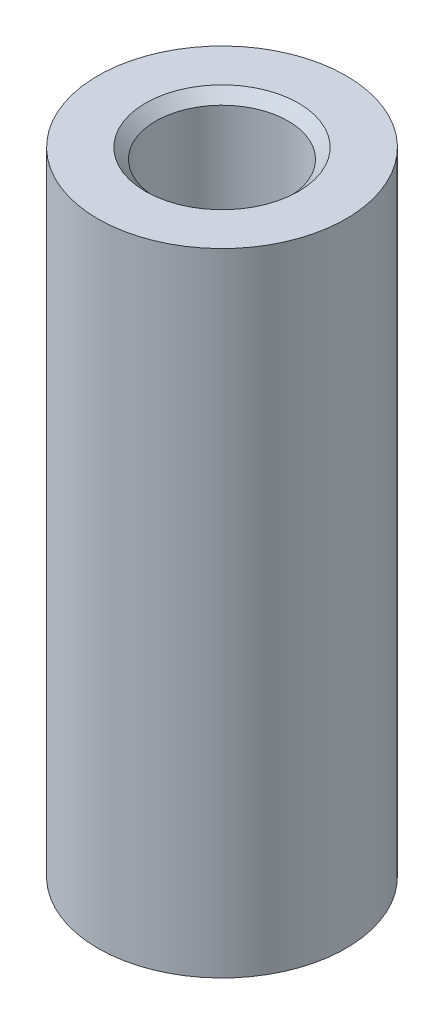
ISO-10303-21;
HEADER;
FILE_DESCRIPTION(('STEP AP214'),'2;1');
FILE_NAME('part.step','',(''),(''),'','','');
FILE_SCHEMA(('AUTOMOTIVE_DESIGN { 1 0 10303 214 1 1 1 1 }'));
ENDSEC;
DATA;
#1=APPLICATION_CONTEXT('core data for automotive mechanical design processes');
#2=APPLICATION_PROTOCOL_DEFINITION('international standard','automotive_design',2000,#1);
#3=PRODUCT_CONTEXT('',#1,'mechanical');
#4=PRODUCT('Part','Part','',(#3));
#5=PRODUCT_RELATED_PRODUCT_CATEGORY('part','',(#4));
#6=PRODUCT_DEFINITION_FORMATION('','',#4);
#7=PRODUCT_DEFINITION_CONTEXT('part definition',#1,'design');
#8=PRODUCT_DEFINITION('design','',#6,#7);
#9=PRODUCT_DEFINITION_SHAPE('','',#8);
#10=(LENGTH_UNIT() NAMED_UNIT(*) SI_UNIT(.MILLI.,.METRE.));
#11=(NAMED_UNIT(*) PLANE_ANGLE_UNIT() SI_UNIT($,.RADIAN.));
#12=(NAMED_UNIT(*) SI_UNIT($,.STERADIAN.) SOLID_ANGLE_UNIT());
#13=UNCERTAINTY_MEASURE_WITH_UNIT(LENGTH_MEASURE(1.E-05),#10,'distance_accuracy_value','');
#14=(GEOMETRIC_REPRESENTATION_CONTEXT(3) GLOBAL_UNCERTAINTY_ASSIGNED_CONTEXT((#13)) GLOBAL_UNIT_ASSIGNED_CONTEXT((#10,
#11,#12)) REPRESENTATION_CONTEXT('',''));
#15=CARTESIAN_POINT('',(0.,0.,0.));
#16=DIRECTION('',(0.,0.,1.));
#17=DIRECTION('',(1.,0.,0.));
#18=AXIS2_PLACEMENT_3D('',#15,#16,#17);
#19=CARTESIAN_POINT('',(0.,15.275,0.));
#20=DIRECTION('',(0.,-1.,0.));
#21=DIRECTION('',(0.,0.,-1.));
#22=AXIS2_PLACEMENT_3D('',#19,#20,#21);
#23=CYLINDRICAL_SURFACE('',#22,3.);
#24=CARTESIAN_POINT('',(0.,15.275,0.));
#25=DIRECTION('',(0.,1.,0.));
#26=DIRECTION('',(0.,0.,1.));
#27=AXIS2_PLACEMENT_3D('',#24,#25,#26);
#28=CIRCLE('',#27,3.);
#29=CARTESIAN_POINT('',(0.,15.275,3.));
#30=VERTEX_POINT('',#29);
#31=EDGE_CURVE('E60',#30,#30,#28,.T.);
#32=ORIENTED_EDGE('',*,*,#31,.F.);
#33=EDGE_LOOP('',(#32));
#34=FACE_BOUND('',#33,.T.);
#35=CARTESIAN_POINT('',(0.,0.,0.));
#36=DIRECTION('',(0.,1.,0.));
#37=DIRECTION('',(0.,0.,1.));
#38=AXIS2_PLACEMENT_3D('',#35,#36,#37);
#39=CIRCLE('',#38,3.);
#40=CARTESIAN_POINT('',(0.,0.,3.));
#41=VERTEX_POINT('',#40);
#42=EDGE_CURVE('E61',#41,#41,#39,.T.);
#43=ORIENTED_EDGE('',*,*,#42,.T.);
#44=EDGE_LOOP('',(#43));
#45=FACE_BOUND('',#44,.T.);
#46=ADVANCED_FACE('F39',(#34,#45),#23,.T.);
#47=CARTESIAN_POINT('',(0.,15.275,0.));
#48=DIRECTION('',(0.,1.,0.));
#49=DIRECTION('',(0.,0.,1.));
#50=AXIS2_PLACEMENT_3D('',#47,#48,#49);
#51=PLANE('',#50);
#52=CARTESIAN_POINT('',(0.,15.275,0.));
#53=DIRECTION('',(0.,1.,0.));
#54=DIRECTION('',(0.,0.,1.));
#55=AXIS2_PLACEMENT_3D('',#52,#53,#54);
#56=CIRCLE('',#55,1.84999999999999);
#57=CARTESIAN_POINT('',(0.,15.275,1.84999999999999));
#58=VERTEX_POINT('',#57);
#59=EDGE_CURVE('E47',#58,#58,#56,.F.);
#60=ORIENTED_EDGE('',*,*,#59,.T.);
#61=EDGE_LOOP('',(#60));
#62=FACE_BOUND('',#61,.T.);
#63=ORIENTED_EDGE('',*,*,#31,.T.);
#64=EDGE_LOOP('',(#63));
#65=FACE_BOUND('',#64,.T.);
#66=ADVANCED_FACE('F67',(#62,#65),#51,.T.);
#67=CARTESIAN_POINT('',(0.,0.,0.));
#68=DIRECTION('',(0.,1.,0.));
#69=DIRECTION('',(0.,0.,1.));
#70=AXIS2_PLACEMENT_3D('',#67,#68,#69);
#71=PLANE('',#70);
#72=CARTESIAN_POINT('',(0.,0.,0.));
#73=DIRECTION('',(0.,1.,0.));
#74=DIRECTION('',(0.,0.,1.));
#75=AXIS2_PLACEMENT_3D('',#72,#73,#74);
#76=CIRCLE('',#75,1.85);
#77=CARTESIAN_POINT('',(0.,0.,1.85));
#78=VERTEX_POINT('',#77);
#79=EDGE_CURVE('E10',#78,#78,#76,.T.);
#80=ORIENTED_EDGE('',*,*,#79,.T.);
#81=EDGE_LOOP('',(#80));
#82=FACE_BOUND('',#81,.T.);
#83=ORIENTED_EDGE('',*,*,#42,.F.);
#84=EDGE_LOOP('',(#83));
#85=FACE_BOUND('',#84,.T.);
#86=ADVANCED_FACE('F74',(#82,#85),#71,.F.);
#87=CARTESIAN_POINT('',(0.,15.275,0.));
#88=DIRECTION('',(0.,1.,0.));
#89=DIRECTION('',(0.,0.,1.));
#90=AXIS2_PLACEMENT_3D('',#87,#88,#89);
#91=CYLINDRICAL_SURFACE('',#90,1.59999999999999);
#92=CARTESIAN_POINT('',(0.,15.025,0.));
#93=DIRECTION('',(0.,1.,0.));
#94=DIRECTION('',(0.,0.,1.));
#95=AXIS2_PLACEMENT_3D('',#92,#93,#94);
#96=CIRCLE('',#95,1.59999999999999);
#97=CARTESIAN_POINT('',(0.,15.025,1.59999999999999));
#98=VERTEX_POINT('',#97);
#99=EDGE_CURVE('E51',#98,#98,#96,.T.);
#100=ORIENTED_EDGE('',*,*,#99,.T.);
#101=EDGE_LOOP('',(#100));
#102=FACE_BOUND('',#101,.T.);
#103=CARTESIAN_POINT('',(0.,0.250000000000005,0.));
#104=DIRECTION('',(0.,1.,0.));
#105=DIRECTION('',(0.,0.,1.));
#106=AXIS2_PLACEMENT_3D('',#103,#104,#105);
#107=CIRCLE('',#106,1.59999999999999);
#108=CARTESIAN_POINT('',(0.,0.250000000000005,1.59999999999999));
#109=VERTEX_POINT('',#108);
#110=EDGE_CURVE('E55',#109,#109,#107,.F.);
#111=ORIENTED_EDGE('',*,*,#110,.T.);
#112=EDGE_LOOP('',(#111));
#113=FACE_BOUND('',#112,.T.);
#114=ADVANCED_FACE('F76',(#102,#113),#91,.F.);
#115=CARTESIAN_POINT('',(0.,15.025,0.));
#116=DIRECTION('',(0.,1.,0.));
#117=DIRECTION('',(0.,0.,1.));
#118=AXIS2_PLACEMENT_3D('',#115,#116,#117);
#119=CONICAL_SURFACE('',#118,1.59999999999999,0.785398163397453);
#120=ORIENTED_EDGE('',*,*,#59,.F.);
#121=EDGE_LOOP('',(#120));
#122=FACE_BOUND('',#121,.T.);
#123=ORIENTED_EDGE('',*,*,#99,.F.);
#124=EDGE_LOOP('',(#123));
#125=FACE_BOUND('',#124,.T.);
#126=ADVANCED_FACE('F82',(#122,#125),#119,.F.);
#127=CARTESIAN_POINT('',(0.,0.,0.));
#128=DIRECTION('',(0.,-1.,0.));
#129=DIRECTION('',(0.,0.,-1.));
#130=AXIS2_PLACEMENT_3D('',#127,#128,#129);
#131=CONICAL_SURFACE('',#130,1.85,0.785398163397446);
#132=ORIENTED_EDGE('',*,*,#110,.F.);
#133=EDGE_LOOP('',(#132));
#134=FACE_BOUND('',#133,.T.);
#135=ORIENTED_EDGE('',*,*,#79,.F.);
#136=EDGE_LOOP('',(#135));
#137=FACE_BOUND('',#136,.T.);
#138=ADVANCED_FACE('F42',(#134,#137),#131,.F.);
#139=CLOSED_SHELL('',(#46,#66,#86,#114,#126,#138));
#140=MANIFOLD_SOLID_BREP('B2',#139);
#141=ADVANCED_BREP_SHAPE_REPRESENTATION('',(#18,#140),#14);
#142=SHAPE_DEFINITION_REPRESENTATION(#9,#141);
ENDSEC;
END-ISO-10303-21;
